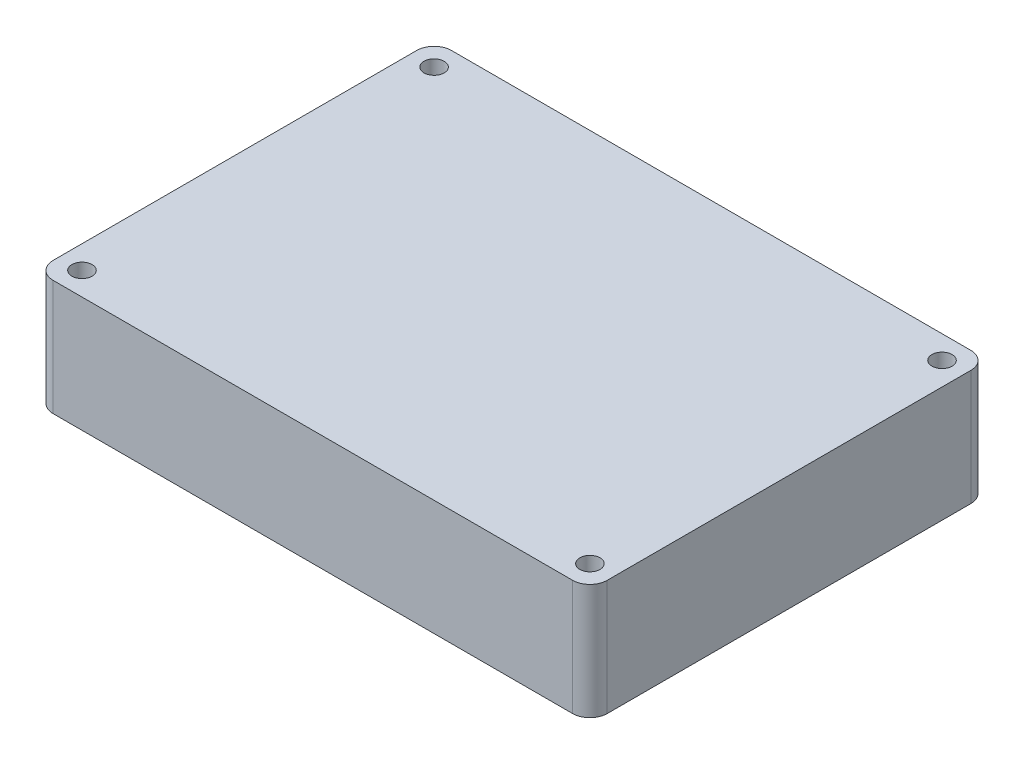
ISO-10303-21;
HEADER;
FILE_DESCRIPTION(('STEP AP214'),'2;1');
FILE_NAME('part.step','',(''),(''),'','','');
FILE_SCHEMA(('AUTOMOTIVE_DESIGN { 1 0 10303 214 1 1 1 1 }'));
ENDSEC;
DATA;
#1=APPLICATION_CONTEXT('core data for automotive mechanical design processes');
#2=APPLICATION_PROTOCOL_DEFINITION('international standard','automotive_design',2000,#1);
#3=PRODUCT_CONTEXT('',#1,'mechanical');
#4=PRODUCT('Part','Part','',(#3));
#5=PRODUCT_RELATED_PRODUCT_CATEGORY('part','',(#4));
#6=PRODUCT_DEFINITION_FORMATION('','',#4);
#7=PRODUCT_DEFINITION_CONTEXT('part definition',#1,'design');
#8=PRODUCT_DEFINITION('design','',#6,#7);
#9=PRODUCT_DEFINITION_SHAPE('','',#8);
#10=(LENGTH_UNIT() NAMED_UNIT(*) SI_UNIT(.MILLI.,.METRE.));
#11=(NAMED_UNIT(*) PLANE_ANGLE_UNIT() SI_UNIT($,.RADIAN.));
#12=(NAMED_UNIT(*) SI_UNIT($,.STERADIAN.) SOLID_ANGLE_UNIT());
#13=UNCERTAINTY_MEASURE_WITH_UNIT(LENGTH_MEASURE(1.E-05),#10,'distance_accuracy_value','');
#14=(GEOMETRIC_REPRESENTATION_CONTEXT(3) GLOBAL_UNCERTAINTY_ASSIGNED_CONTEXT((#13)) GLOBAL_UNIT_ASSIGNED_CONTEXT((#10,
#11,#12)) REPRESENTATION_CONTEXT('',''));
#15=CARTESIAN_POINT('',(0.,0.,0.));
#16=DIRECTION('',(0.,0.,1.));
#17=DIRECTION('',(1.,0.,0.));
#18=AXIS2_PLACEMENT_3D('',#15,#16,#17);
#19=CARTESIAN_POINT('',(0.,20.,0.));
#20=DIRECTION('',(0.,-1.,0.));
#21=DIRECTION('',(0.,0.,-1.));
#22=AXIS2_PLACEMENT_3D('',#19,#20,#21);
#23=PLANE('',#22);
#24=DIRECTION('',(0.,0.,1.));
#25=VECTOR('',#24,1.);
#26=CARTESIAN_POINT('',(-48.,20.,34.5));
#27=LINE('',#26,#25);
#28=CARTESIAN_POINT('',(-48.,20.,-31.5));
#29=VERTEX_POINT('',#28);
#30=CARTESIAN_POINT('',(-48.,20.,31.5));
#31=VERTEX_POINT('',#30);
#32=EDGE_CURVE('E206',#29,#31,#27,.T.);
#33=ORIENTED_EDGE('',*,*,#32,.T.);
#34=CARTESIAN_POINT('',(-45.,20.,31.5));
#35=DIRECTION('',(0.,-1.,0.));
#36=DIRECTION('',(0.,0.,-1.));
#37=AXIS2_PLACEMENT_3D('',#34,#35,#36);
#38=CIRCLE('',#37,3.);
#39=CARTESIAN_POINT('',(-45.,20.,34.5));
#40=VERTEX_POINT('',#39);
#41=EDGE_CURVE('E175',#31,#40,#38,.F.);
#42=ORIENTED_EDGE('',*,*,#41,.T.);
#43=DIRECTION('',(1.,0.,0.));
#44=VECTOR('',#43,1.);
#45=CARTESIAN_POINT('',(-48.,20.,34.5));
#46=LINE('',#45,#44);
#47=CARTESIAN_POINT('',(45.,20.,34.5));
#48=VERTEX_POINT('',#47);
#49=EDGE_CURVE('E133',#40,#48,#46,.T.);
#50=ORIENTED_EDGE('',*,*,#49,.T.);
#51=CARTESIAN_POINT('',(45.,20.,31.5));
#52=DIRECTION('',(0.,-1.,0.));
#53=DIRECTION('',(0.,0.,-1.));
#54=AXIS2_PLACEMENT_3D('',#51,#52,#53);
#55=CIRCLE('',#54,3.);
#56=CARTESIAN_POINT('',(48.,20.,31.5));
#57=VERTEX_POINT('',#56);
#58=EDGE_CURVE('E167',#48,#57,#55,.F.);
#59=ORIENTED_EDGE('',*,*,#58,.T.);
#60=DIRECTION('',(0.,0.,-1.));
#61=VECTOR('',#60,1.);
#62=CARTESIAN_POINT('',(48.,20.,34.5));
#63=LINE('',#62,#61);
#64=CARTESIAN_POINT('',(48.,20.,-31.5));
#65=VERTEX_POINT('',#64);
#66=EDGE_CURVE('E142',#57,#65,#63,.T.);
#67=ORIENTED_EDGE('',*,*,#66,.T.);
#68=CARTESIAN_POINT('',(45.,20.,-31.5));
#69=DIRECTION('',(0.,-1.,0.));
#70=DIRECTION('',(0.,0.,-1.));
#71=AXIS2_PLACEMENT_3D('',#68,#69,#70);
#72=CIRCLE('',#71,3.);
#73=CARTESIAN_POINT('',(45.,20.,-34.5));
#74=VERTEX_POINT('',#73);
#75=EDGE_CURVE('E68',#65,#74,#72,.F.);
#76=ORIENTED_EDGE('',*,*,#75,.T.);
#77=DIRECTION('',(-1.,0.,0.));
#78=VECTOR('',#77,1.);
#79=CARTESIAN_POINT('',(-48.,20.,-34.5));
#80=LINE('',#79,#78);
#81=CARTESIAN_POINT('',(-45.,20.,-34.5));
#82=VERTEX_POINT('',#81);
#83=EDGE_CURVE('E147',#74,#82,#80,.T.);
#84=ORIENTED_EDGE('',*,*,#83,.T.);
#85=CARTESIAN_POINT('',(-45.,20.,-31.5));
#86=DIRECTION('',(0.,-1.,0.));
#87=DIRECTION('',(0.,0.,-1.));
#88=AXIS2_PLACEMENT_3D('',#85,#86,#87);
#89=CIRCLE('',#88,3.);
#90=EDGE_CURVE('E172',#82,#29,#89,.F.);
#91=ORIENTED_EDGE('',*,*,#90,.T.);
#92=EDGE_LOOP('',(#33,#42,#50,#59,#67,#76,#84,#91));
#93=FACE_BOUND('',#92,.T.);
#94=CARTESIAN_POINT('',(-44.,20.,-30.5));
#95=DIRECTION('',(0.,1.,0.));
#96=DIRECTION('',(0.,0.,1.));
#97=AXIS2_PLACEMENT_3D('',#94,#95,#96);
#98=CIRCLE('',#97,1.75);
#99=CARTESIAN_POINT('',(-44.,20.,-28.75));
#100=VERTEX_POINT('',#99);
#101=EDGE_CURVE('E196',#100,#100,#98,.T.);
#102=ORIENTED_EDGE('',*,*,#101,.F.);
#103=EDGE_LOOP('',(#102));
#104=FACE_BOUND('',#103,.T.);
#105=CARTESIAN_POINT('',(44.,20.,-30.5));
#106=DIRECTION('',(0.,1.,0.));
#107=DIRECTION('',(0.,0.,1.));
#108=AXIS2_PLACEMENT_3D('',#105,#106,#107);
#109=CIRCLE('',#108,1.75);
#110=CARTESIAN_POINT('',(44.,20.,-28.75));
#111=VERTEX_POINT('',#110);
#112=EDGE_CURVE('E214',#111,#111,#109,.T.);
#113=ORIENTED_EDGE('',*,*,#112,.F.);
#114=EDGE_LOOP('',(#113));
#115=FACE_BOUND('',#114,.T.);
#116=CARTESIAN_POINT('',(-44.,20.,30.5));
#117=DIRECTION('',(0.,1.,0.));
#118=DIRECTION('',(0.,0.,1.));
#119=AXIS2_PLACEMENT_3D('',#116,#117,#118);
#120=CIRCLE('',#119,1.75);
#121=CARTESIAN_POINT('',(-44.,20.,32.25));
#122=VERTEX_POINT('',#121);
#123=EDGE_CURVE('E220',#122,#122,#120,.T.);
#124=ORIENTED_EDGE('',*,*,#123,.F.);
#125=EDGE_LOOP('',(#124));
#126=FACE_BOUND('',#125,.T.);
#127=CARTESIAN_POINT('',(44.,20.,30.5));
#128=DIRECTION('',(0.,1.,0.));
#129=DIRECTION('',(0.,0.,1.));
#130=AXIS2_PLACEMENT_3D('',#127,#128,#129);
#131=CIRCLE('',#130,1.75);
#132=CARTESIAN_POINT('',(44.,20.,32.25));
#133=VERTEX_POINT('',#132);
#134=EDGE_CURVE('E228',#133,#133,#131,.T.);
#135=ORIENTED_EDGE('',*,*,#134,.F.);
#136=EDGE_LOOP('',(#135));
#137=FACE_BOUND('',#136,.T.);
#138=ADVANCED_FACE('F45',(#93,#104,#115,#126,#137),#23,.F.);
#139=CARTESIAN_POINT('',(0.,0.,0.));
#140=DIRECTION('',(0.,-1.,0.));
#141=DIRECTION('',(0.,0.,-1.));
#142=AXIS2_PLACEMENT_3D('',#139,#140,#141);
#143=PLANE('',#142);
#144=CARTESIAN_POINT('',(-44.,0.,30.5));
#145=DIRECTION('',(0.,1.,0.));
#146=DIRECTION('',(0.,0.,1.));
#147=AXIS2_PLACEMENT_3D('',#144,#145,#146);
#148=CIRCLE('',#147,1.75);
#149=CARTESIAN_POINT('',(-44.,0.,32.25));
#150=VERTEX_POINT('',#149);
#151=EDGE_CURVE('E224',#150,#150,#148,.T.);
#152=ORIENTED_EDGE('',*,*,#151,.T.);
#153=EDGE_LOOP('',(#152));
#154=FACE_BOUND('',#153,.T.);
#155=CARTESIAN_POINT('',(-44.,0.,-30.5));
#156=DIRECTION('',(0.,1.,0.));
#157=DIRECTION('',(0.,0.,1.));
#158=AXIS2_PLACEMENT_3D('',#155,#156,#157);
#159=CIRCLE('',#158,1.75);
#160=CARTESIAN_POINT('',(-44.,0.,-28.75));
#161=VERTEX_POINT('',#160);
#162=EDGE_CURVE('E201',#161,#161,#159,.T.);
#163=ORIENTED_EDGE('',*,*,#162,.T.);
#164=EDGE_LOOP('',(#163));
#165=FACE_BOUND('',#164,.T.);
#166=DIRECTION('',(1.,0.,0.));
#167=VECTOR('',#166,1.);
#168=CARTESIAN_POINT('',(-48.,0.,34.5));
#169=LINE('',#168,#167);
#170=CARTESIAN_POINT('',(-45.,0.,34.5));
#171=VERTEX_POINT('',#170);
#172=CARTESIAN_POINT('',(45.,0.,34.5));
#173=VERTEX_POINT('',#172);
#174=EDGE_CURVE('E130',#171,#173,#169,.T.);
#175=ORIENTED_EDGE('',*,*,#174,.F.);
#176=CARTESIAN_POINT('',(-45.,0.,31.5));
#177=DIRECTION('',(0.,-1.,0.));
#178=DIRECTION('',(0.,0.,-1.));
#179=AXIS2_PLACEMENT_3D('',#176,#177,#178);
#180=CIRCLE('',#179,3.);
#181=CARTESIAN_POINT('',(-48.,0.,31.5));
#182=VERTEX_POINT('',#181);
#183=EDGE_CURVE('E112',#171,#182,#180,.T.);
#184=ORIENTED_EDGE('',*,*,#183,.T.);
#185=DIRECTION('',(0.,0.,1.));
#186=VECTOR('',#185,1.);
#187=CARTESIAN_POINT('',(-48.,0.,34.5));
#188=LINE('',#187,#186);
#189=CARTESIAN_POINT('',(-48.,0.,-31.5));
#190=VERTEX_POINT('',#189);
#191=EDGE_CURVE('E143',#190,#182,#188,.T.);
#192=ORIENTED_EDGE('',*,*,#191,.F.);
#193=CARTESIAN_POINT('',(-45.,0.,-31.5));
#194=DIRECTION('',(0.,-1.,0.));
#195=DIRECTION('',(0.,0.,-1.));
#196=AXIS2_PLACEMENT_3D('',#193,#194,#195);
#197=CIRCLE('',#196,3.);
#198=CARTESIAN_POINT('',(-45.,0.,-34.5));
#199=VERTEX_POINT('',#198);
#200=EDGE_CURVE('E124',#190,#199,#197,.T.);
#201=ORIENTED_EDGE('',*,*,#200,.T.);
#202=DIRECTION('',(-1.,0.,0.));
#203=VECTOR('',#202,1.);
#204=CARTESIAN_POINT('',(-48.,0.,-34.5));
#205=LINE('',#204,#203);
#206=CARTESIAN_POINT('',(45.,0.,-34.5));
#207=VERTEX_POINT('',#206);
#208=EDGE_CURVE('E149',#207,#199,#205,.T.);
#209=ORIENTED_EDGE('',*,*,#208,.F.);
#210=CARTESIAN_POINT('',(45.,0.,-31.5));
#211=DIRECTION('',(0.,-1.,0.));
#212=DIRECTION('',(0.,0.,-1.));
#213=AXIS2_PLACEMENT_3D('',#210,#211,#212);
#214=CIRCLE('',#213,3.);
#215=CARTESIAN_POINT('',(48.,0.,-31.5));
#216=VERTEX_POINT('',#215);
#217=EDGE_CURVE('E157',#207,#216,#214,.T.);
#218=ORIENTED_EDGE('',*,*,#217,.T.);
#219=DIRECTION('',(0.,0.,-1.));
#220=VECTOR('',#219,1.);
#221=CARTESIAN_POINT('',(48.,0.,34.5));
#222=LINE('',#221,#220);
#223=CARTESIAN_POINT('',(48.,0.,31.5));
#224=VERTEX_POINT('',#223);
#225=EDGE_CURVE('E190',#224,#216,#222,.T.);
#226=ORIENTED_EDGE('',*,*,#225,.F.);
#227=CARTESIAN_POINT('',(45.,0.,31.5));
#228=DIRECTION('',(0.,-1.,0.));
#229=DIRECTION('',(0.,0.,-1.));
#230=AXIS2_PLACEMENT_3D('',#227,#228,#229);
#231=CIRCLE('',#230,3.);
#232=EDGE_CURVE('E135',#224,#173,#231,.T.);
#233=ORIENTED_EDGE('',*,*,#232,.T.);
#234=EDGE_LOOP('',(#175,#184,#192,#201,#209,#218,#226,#233));
#235=FACE_BOUND('',#234,.T.);
#236=CARTESIAN_POINT('',(44.,0.,-30.5));
#237=DIRECTION('',(0.,1.,0.));
#238=DIRECTION('',(0.,0.,1.));
#239=AXIS2_PLACEMENT_3D('',#236,#237,#238);
#240=CIRCLE('',#239,1.75);
#241=CARTESIAN_POINT('',(44.,0.,-28.75));
#242=VERTEX_POINT('',#241);
#243=EDGE_CURVE('E216',#242,#242,#240,.T.);
#244=ORIENTED_EDGE('',*,*,#243,.T.);
#245=EDGE_LOOP('',(#244));
#246=FACE_BOUND('',#245,.T.);
#247=CARTESIAN_POINT('',(44.,0.,30.5));
#248=DIRECTION('',(0.,1.,0.));
#249=DIRECTION('',(0.,0.,1.));
#250=AXIS2_PLACEMENT_3D('',#247,#248,#249);
#251=CIRCLE('',#250,1.75);
#252=CARTESIAN_POINT('',(44.,0.,32.25));
#253=VERTEX_POINT('',#252);
#254=EDGE_CURVE('E232',#253,#253,#251,.T.);
#255=ORIENTED_EDGE('',*,*,#254,.T.);
#256=EDGE_LOOP('',(#255));
#257=FACE_BOUND('',#256,.T.);
#258=ADVANCED_FACE('F138',(#154,#165,#235,#246,#257),#143,.T.);
#259=CARTESIAN_POINT('',(48.,20.,34.5));
#260=DIRECTION('',(-1.,0.,0.));
#261=DIRECTION('',(0.,0.,1.));
#262=AXIS2_PLACEMENT_3D('',#259,#260,#261);
#263=PLANE('',#262);
#264=ORIENTED_EDGE('',*,*,#225,.T.);
#265=DIRECTION('',(0.,-1.,0.));
#266=VECTOR('',#265,1.);
#267=CARTESIAN_POINT('',(48.,20.,-31.5));
#268=LINE('',#267,#266);
#269=EDGE_CURVE('E11',#216,#65,#268,.F.);
#270=ORIENTED_EDGE('',*,*,#269,.T.);
#271=ORIENTED_EDGE('',*,*,#66,.F.);
#272=DIRECTION('',(0.,-1.,0.));
#273=VECTOR('',#272,1.);
#274=CARTESIAN_POINT('',(48.,20.,31.5));
#275=LINE('',#274,#273);
#276=EDGE_CURVE('E54',#57,#224,#275,.T.);
#277=ORIENTED_EDGE('',*,*,#276,.T.);
#278=EDGE_LOOP('',(#264,#270,#271,#277));
#279=FACE_BOUND('',#278,.T.);
#280=ADVANCED_FACE('F189',(#279),#263,.F.);
#281=CARTESIAN_POINT('',(-48.,20.,-34.5));
#282=DIRECTION('',(0.,0.,1.));
#283=DIRECTION('',(1.,0.,0.));
#284=AXIS2_PLACEMENT_3D('',#281,#282,#283);
#285=PLANE('',#284);
#286=ORIENTED_EDGE('',*,*,#208,.T.);
#287=DIRECTION('',(0.,-1.,0.));
#288=VECTOR('',#287,1.);
#289=CARTESIAN_POINT('',(-45.,20.,-34.5));
#290=LINE('',#289,#288);
#291=EDGE_CURVE('E61',#199,#82,#290,.F.);
#292=ORIENTED_EDGE('',*,*,#291,.T.);
#293=ORIENTED_EDGE('',*,*,#83,.F.);
#294=DIRECTION('',(0.,-1.,0.));
#295=VECTOR('',#294,1.);
#296=CARTESIAN_POINT('',(45.,20.,-34.5));
#297=LINE('',#296,#295);
#298=EDGE_CURVE('E178',#74,#207,#297,.T.);
#299=ORIENTED_EDGE('',*,*,#298,.T.);
#300=EDGE_LOOP('',(#286,#292,#293,#299));
#301=FACE_BOUND('',#300,.T.);
#302=ADVANCED_FACE('F261',(#301),#285,.F.);
#303=CARTESIAN_POINT('',(-48.,20.,34.5));
#304=DIRECTION('',(1.,0.,0.));
#305=DIRECTION('',(0.,0.,-1.));
#306=AXIS2_PLACEMENT_3D('',#303,#304,#305);
#307=PLANE('',#306);
#308=ORIENTED_EDGE('',*,*,#191,.T.);
#309=DIRECTION('',(0.,-1.,0.));
#310=VECTOR('',#309,1.);
#311=CARTESIAN_POINT('',(-48.,20.,31.5));
#312=LINE('',#311,#310);
#313=EDGE_CURVE('E117',#182,#31,#312,.F.);
#314=ORIENTED_EDGE('',*,*,#313,.T.);
#315=ORIENTED_EDGE('',*,*,#32,.F.);
#316=DIRECTION('',(0.,-1.,0.));
#317=VECTOR('',#316,1.);
#318=CARTESIAN_POINT('',(-48.,20.,-31.5));
#319=LINE('',#318,#317);
#320=EDGE_CURVE('E123',#29,#190,#319,.T.);
#321=ORIENTED_EDGE('',*,*,#320,.T.);
#322=EDGE_LOOP('',(#308,#314,#315,#321));
#323=FACE_BOUND('',#322,.T.);
#324=ADVANCED_FACE('F258',(#323),#307,.F.);
#325=CARTESIAN_POINT('',(-48.,20.,34.5));
#326=DIRECTION('',(0.,0.,-1.));
#327=DIRECTION('',(-1.,0.,0.));
#328=AXIS2_PLACEMENT_3D('',#325,#326,#327);
#329=PLANE('',#328);
#330=ORIENTED_EDGE('',*,*,#49,.F.);
#331=DIRECTION('',(0.,-1.,0.));
#332=VECTOR('',#331,1.);
#333=CARTESIAN_POINT('',(-45.,20.,34.5));
#334=LINE('',#333,#332);
#335=EDGE_CURVE('E116',#40,#171,#334,.T.);
#336=ORIENTED_EDGE('',*,*,#335,.T.);
#337=ORIENTED_EDGE('',*,*,#174,.T.);
#338=DIRECTION('',(0.,-1.,0.));
#339=VECTOR('',#338,1.);
#340=CARTESIAN_POINT('',(45.,20.,34.5));
#341=LINE('',#340,#339);
#342=EDGE_CURVE('E136',#173,#48,#341,.F.);
#343=ORIENTED_EDGE('',*,*,#342,.T.);
#344=EDGE_LOOP('',(#330,#336,#337,#343));
#345=FACE_BOUND('',#344,.T.);
#346=ADVANCED_FACE('F129',(#345),#329,.F.);
#347=CARTESIAN_POINT('',(-44.,20.,-30.5));
#348=DIRECTION('',(0.,-1.,0.));
#349=DIRECTION('',(0.,0.,-1.));
#350=AXIS2_PLACEMENT_3D('',#347,#348,#349);
#351=CYLINDRICAL_SURFACE('',#350,1.75);
#352=ORIENTED_EDGE('',*,*,#101,.T.);
#353=EDGE_LOOP('',(#352));
#354=FACE_BOUND('',#353,.T.);
#355=ORIENTED_EDGE('',*,*,#162,.F.);
#356=EDGE_LOOP('',(#355));
#357=FACE_BOUND('',#356,.T.);
#358=ADVANCED_FACE('F253',(#354,#357),#351,.F.);
#359=CARTESIAN_POINT('',(44.,20.,-30.5));
#360=DIRECTION('',(0.,-1.,0.));
#361=DIRECTION('',(0.,0.,-1.));
#362=AXIS2_PLACEMENT_3D('',#359,#360,#361);
#363=CYLINDRICAL_SURFACE('',#362,1.75);
#364=ORIENTED_EDGE('',*,*,#112,.T.);
#365=EDGE_LOOP('',(#364));
#366=FACE_BOUND('',#365,.T.);
#367=ORIENTED_EDGE('',*,*,#243,.F.);
#368=EDGE_LOOP('',(#367));
#369=FACE_BOUND('',#368,.T.);
#370=ADVANCED_FACE('F318',(#366,#369),#363,.F.);
#371=CARTESIAN_POINT('',(-44.,20.,30.5));
#372=DIRECTION('',(0.,-1.,0.));
#373=DIRECTION('',(0.,0.,-1.));
#374=AXIS2_PLACEMENT_3D('',#371,#372,#373);
#375=CYLINDRICAL_SURFACE('',#374,1.75);
#376=ORIENTED_EDGE('',*,*,#123,.T.);
#377=EDGE_LOOP('',(#376));
#378=FACE_BOUND('',#377,.T.);
#379=ORIENTED_EDGE('',*,*,#151,.F.);
#380=EDGE_LOOP('',(#379));
#381=FACE_BOUND('',#380,.T.);
#382=ADVANCED_FACE('F309',(#378,#381),#375,.F.);
#383=CARTESIAN_POINT('',(44.,20.,30.5));
#384=DIRECTION('',(0.,-1.,0.));
#385=DIRECTION('',(0.,0.,-1.));
#386=AXIS2_PLACEMENT_3D('',#383,#384,#385);
#387=CYLINDRICAL_SURFACE('',#386,1.75);
#388=ORIENTED_EDGE('',*,*,#134,.T.);
#389=EDGE_LOOP('',(#388));
#390=FACE_BOUND('',#389,.T.);
#391=ORIENTED_EDGE('',*,*,#254,.F.);
#392=EDGE_LOOP('',(#391));
#393=FACE_BOUND('',#392,.T.);
#394=ADVANCED_FACE('F240',(#390,#393),#387,.F.);
#395=CARTESIAN_POINT('',(-45.,20.,31.5));
#396=DIRECTION('',(0.,-1.,0.));
#397=DIRECTION('',(0.,0.,-1.));
#398=AXIS2_PLACEMENT_3D('',#395,#396,#397);
#399=CYLINDRICAL_SURFACE('',#398,3.);
#400=ORIENTED_EDGE('',*,*,#41,.F.);
#401=ORIENTED_EDGE('',*,*,#313,.F.);
#402=ORIENTED_EDGE('',*,*,#183,.F.);
#403=ORIENTED_EDGE('',*,*,#335,.F.);
#404=EDGE_LOOP('',(#400,#401,#402,#403));
#405=FACE_BOUND('',#404,.T.);
#406=ADVANCED_FACE('F115',(#405),#399,.T.);
#407=CARTESIAN_POINT('',(-45.,20.,-31.5));
#408=DIRECTION('',(0.,-1.,0.));
#409=DIRECTION('',(0.,0.,-1.));
#410=AXIS2_PLACEMENT_3D('',#407,#408,#409);
#411=CYLINDRICAL_SURFACE('',#410,3.);
#412=ORIENTED_EDGE('',*,*,#90,.F.);
#413=ORIENTED_EDGE('',*,*,#291,.F.);
#414=ORIENTED_EDGE('',*,*,#200,.F.);
#415=ORIENTED_EDGE('',*,*,#320,.F.);
#416=EDGE_LOOP('',(#412,#413,#414,#415));
#417=FACE_BOUND('',#416,.T.);
#418=ADVANCED_FACE('F269',(#417),#411,.T.);
#419=CARTESIAN_POINT('',(45.,20.,-31.5));
#420=DIRECTION('',(0.,-1.,0.));
#421=DIRECTION('',(0.,0.,-1.));
#422=AXIS2_PLACEMENT_3D('',#419,#420,#421);
#423=CYLINDRICAL_SURFACE('',#422,3.);
#424=ORIENTED_EDGE('',*,*,#75,.F.);
#425=ORIENTED_EDGE('',*,*,#269,.F.);
#426=ORIENTED_EDGE('',*,*,#217,.F.);
#427=ORIENTED_EDGE('',*,*,#298,.F.);
#428=EDGE_LOOP('',(#424,#425,#426,#427));
#429=FACE_BOUND('',#428,.T.);
#430=ADVANCED_FACE('F271',(#429),#423,.T.);
#431=CARTESIAN_POINT('',(45.,20.,31.5));
#432=DIRECTION('',(0.,-1.,0.));
#433=DIRECTION('',(0.,0.,-1.));
#434=AXIS2_PLACEMENT_3D('',#431,#432,#433);
#435=CYLINDRICAL_SURFACE('',#434,3.);
#436=ORIENTED_EDGE('',*,*,#58,.F.);
#437=ORIENTED_EDGE('',*,*,#342,.F.);
#438=ORIENTED_EDGE('',*,*,#232,.F.);
#439=ORIENTED_EDGE('',*,*,#276,.F.);
#440=EDGE_LOOP('',(#436,#437,#438,#439));
#441=FACE_BOUND('',#440,.T.);
#442=ADVANCED_FACE('F47',(#441),#435,.T.);
#443=CLOSED_SHELL('',(#138,#258,#280,#302,#324,#346,#358,#370,#382,#394,#406,#418,#430,#442));
#444=MANIFOLD_SOLID_BREP('B2',#443);
#445=ADVANCED_BREP_SHAPE_REPRESENTATION('',(#18,#444),#14);
#446=SHAPE_DEFINITION_REPRESENTATION(#9,#445);
ENDSEC;
END-ISO-10303-21;
